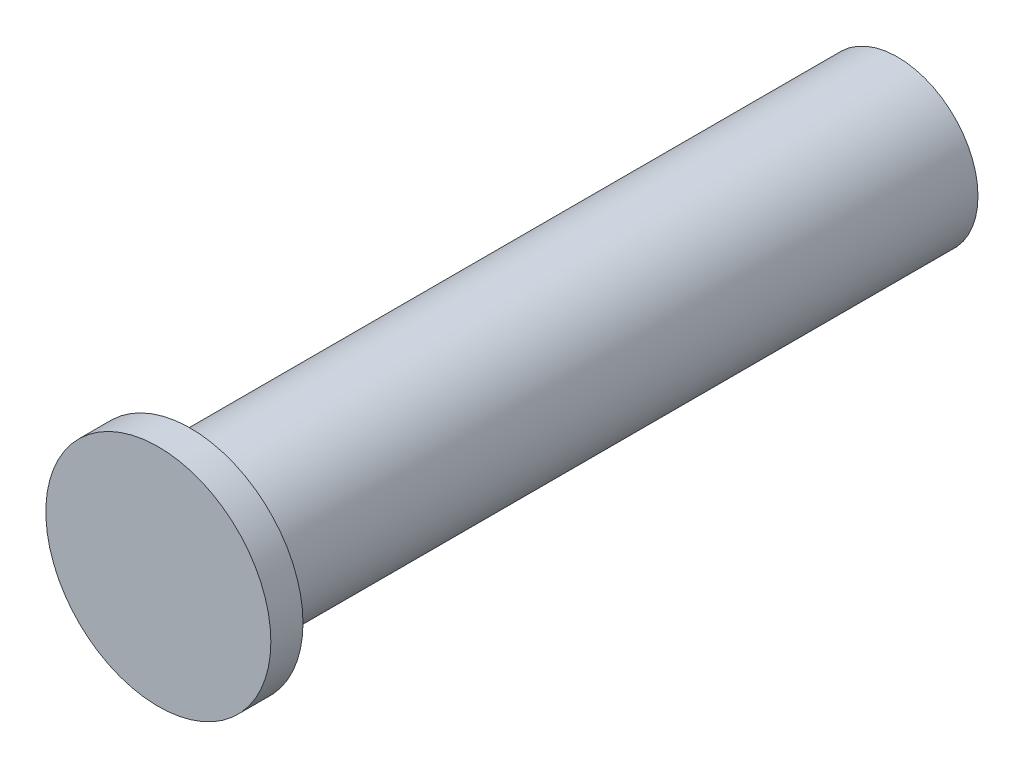
ISO-10303-21;
HEADER;
FILE_DESCRIPTION(('STEP AP214'),'2;1');
FILE_NAME('part.step','',(''),(''),'','','');
FILE_SCHEMA(('AUTOMOTIVE_DESIGN { 1 0 10303 214 1 1 1 1 }'));
ENDSEC;
DATA;
#1=APPLICATION_CONTEXT('core data for automotive mechanical design processes');
#2=APPLICATION_PROTOCOL_DEFINITION('international standard','automotive_design',2000,#1);
#3=PRODUCT_CONTEXT('',#1,'mechanical');
#4=PRODUCT('Part','Part','',(#3));
#5=PRODUCT_RELATED_PRODUCT_CATEGORY('part','',(#4));
#6=PRODUCT_DEFINITION_FORMATION('','',#4);
#7=PRODUCT_DEFINITION_CONTEXT('part definition',#1,'design');
#8=PRODUCT_DEFINITION('design','',#6,#7);
#9=PRODUCT_DEFINITION_SHAPE('','',#8);
#10=(LENGTH_UNIT() NAMED_UNIT(*) SI_UNIT(.MILLI.,.METRE.));
#11=(NAMED_UNIT(*) PLANE_ANGLE_UNIT() SI_UNIT($,.RADIAN.));
#12=(NAMED_UNIT(*) SI_UNIT($,.STERADIAN.) SOLID_ANGLE_UNIT());
#13=UNCERTAINTY_MEASURE_WITH_UNIT(LENGTH_MEASURE(1.E-05),#10,'distance_accuracy_value','');
#14=(GEOMETRIC_REPRESENTATION_CONTEXT(3) GLOBAL_UNCERTAINTY_ASSIGNED_CONTEXT((#13)) GLOBAL_UNIT_ASSIGNED_CONTEXT((#10,
#11,#12)) REPRESENTATION_CONTEXT('',''));
#15=CARTESIAN_POINT('',(0.,0.,0.));
#16=DIRECTION('',(0.,0.,1.));
#17=DIRECTION('',(1.,0.,0.));
#18=AXIS2_PLACEMENT_3D('',#15,#16,#17);
#19=CARTESIAN_POINT('',(0.,0.,110.));
#20=DIRECTION('',(0.,0.,-1.));
#21=DIRECTION('',(-1.,0.,0.));
#22=AXIS2_PLACEMENT_3D('',#19,#20,#21);
#23=CYLINDRICAL_SURFACE('',#22,12.5);
#24=CARTESIAN_POINT('',(0.,0.,110.));
#25=DIRECTION('',(0.,0.,1.));
#26=DIRECTION('',(1.,0.,0.));
#27=AXIS2_PLACEMENT_3D('',#24,#25,#26);
#28=CIRCLE('',#27,12.5);
#29=CARTESIAN_POINT('',(12.5,0.,110.));
#30=VERTEX_POINT('',#29);
#31=EDGE_CURVE('E10',#30,#30,#28,.T.);
#32=ORIENTED_EDGE('',*,*,#31,.F.);
#33=EDGE_LOOP('',(#32));
#34=FACE_BOUND('',#33,.T.);
#35=CARTESIAN_POINT('',(0.,0.,0.));
#36=DIRECTION('',(0.,0.,1.));
#37=DIRECTION('',(1.,0.,0.));
#38=AXIS2_PLACEMENT_3D('',#35,#36,#37);
#39=CIRCLE('',#38,12.5);
#40=CARTESIAN_POINT('',(12.5,0.,0.));
#41=VERTEX_POINT('',#40);
#42=EDGE_CURVE('E34',#41,#41,#39,.T.);
#43=ORIENTED_EDGE('',*,*,#42,.T.);
#44=EDGE_LOOP('',(#43));
#45=FACE_BOUND('',#44,.T.);
#46=ADVANCED_FACE('F31',(#34,#45),#23,.T.);
#47=CARTESIAN_POINT('',(0.,0.,0.));
#48=DIRECTION('',(0.,0.,1.));
#49=DIRECTION('',(1.,0.,0.));
#50=AXIS2_PLACEMENT_3D('',#47,#48,#49);
#51=PLANE('',#50);
#52=ORIENTED_EDGE('',*,*,#42,.F.);
#53=EDGE_LOOP('',(#52));
#54=FACE_BOUND('',#53,.T.);
#55=ADVANCED_FACE('F59',(#54),#51,.F.);
#56=CARTESIAN_POINT('',(0.,0.,110.));
#57=DIRECTION('',(0.,0.,1.));
#58=DIRECTION('',(1.,0.,0.));
#59=AXIS2_PLACEMENT_3D('',#56,#57,#58);
#60=PLANE('',#59);
#61=CARTESIAN_POINT('',(0.,0.,110.));
#62=DIRECTION('',(0.,0.,1.));
#63=DIRECTION('',(1.,0.,0.));
#64=AXIS2_PLACEMENT_3D('',#61,#62,#63);
#65=CIRCLE('',#64,17.5);
#66=CARTESIAN_POINT('',(17.5,0.,110.));
#67=VERTEX_POINT('',#66);
#68=EDGE_CURVE('E43',#67,#67,#65,.T.);
#69=ORIENTED_EDGE('',*,*,#68,.F.);
#70=EDGE_LOOP('',(#69));
#71=FACE_BOUND('',#70,.T.);
#72=ORIENTED_EDGE('',*,*,#31,.T.);
#73=EDGE_LOOP('',(#72));
#74=FACE_BOUND('',#73,.T.);
#75=ADVANCED_FACE('F54',(#71,#74),#60,.F.);
#76=CARTESIAN_POINT('',(0.,0.,115.));
#77=DIRECTION('',(0.,0.,-1.));
#78=DIRECTION('',(-1.,0.,0.));
#79=AXIS2_PLACEMENT_3D('',#76,#77,#78);
#80=CYLINDRICAL_SURFACE('',#79,17.5);
#81=CARTESIAN_POINT('',(0.,0.,115.));
#82=DIRECTION('',(0.,0.,1.));
#83=DIRECTION('',(1.,0.,0.));
#84=AXIS2_PLACEMENT_3D('',#81,#82,#83);
#85=CIRCLE('',#84,17.5);
#86=CARTESIAN_POINT('',(17.5,0.,115.));
#87=VERTEX_POINT('',#86);
#88=EDGE_CURVE('E41',#87,#87,#85,.T.);
#89=ORIENTED_EDGE('',*,*,#88,.F.);
#90=EDGE_LOOP('',(#89));
#91=FACE_BOUND('',#90,.T.);
#92=ORIENTED_EDGE('',*,*,#68,.T.);
#93=EDGE_LOOP('',(#92));
#94=FACE_BOUND('',#93,.T.);
#95=ADVANCED_FACE('F51',(#91,#94),#80,.T.);
#96=CARTESIAN_POINT('',(0.,0.,115.));
#97=DIRECTION('',(0.,0.,1.));
#98=DIRECTION('',(1.,0.,0.));
#99=AXIS2_PLACEMENT_3D('',#96,#97,#98);
#100=PLANE('',#99);
#101=ORIENTED_EDGE('',*,*,#88,.T.);
#102=EDGE_LOOP('',(#101));
#103=FACE_BOUND('',#102,.T.);
#104=ADVANCED_FACE('F49',(#103),#100,.T.);
#105=CLOSED_SHELL('',(#46,#55,#75,#95,#104));
#106=MANIFOLD_SOLID_BREP('B2',#105);
#107=ADVANCED_BREP_SHAPE_REPRESENTATION('',(#18,#106),#14);
#108=SHAPE_DEFINITION_REPRESENTATION(#9,#107);
ENDSEC;
END-ISO-10303-21;
